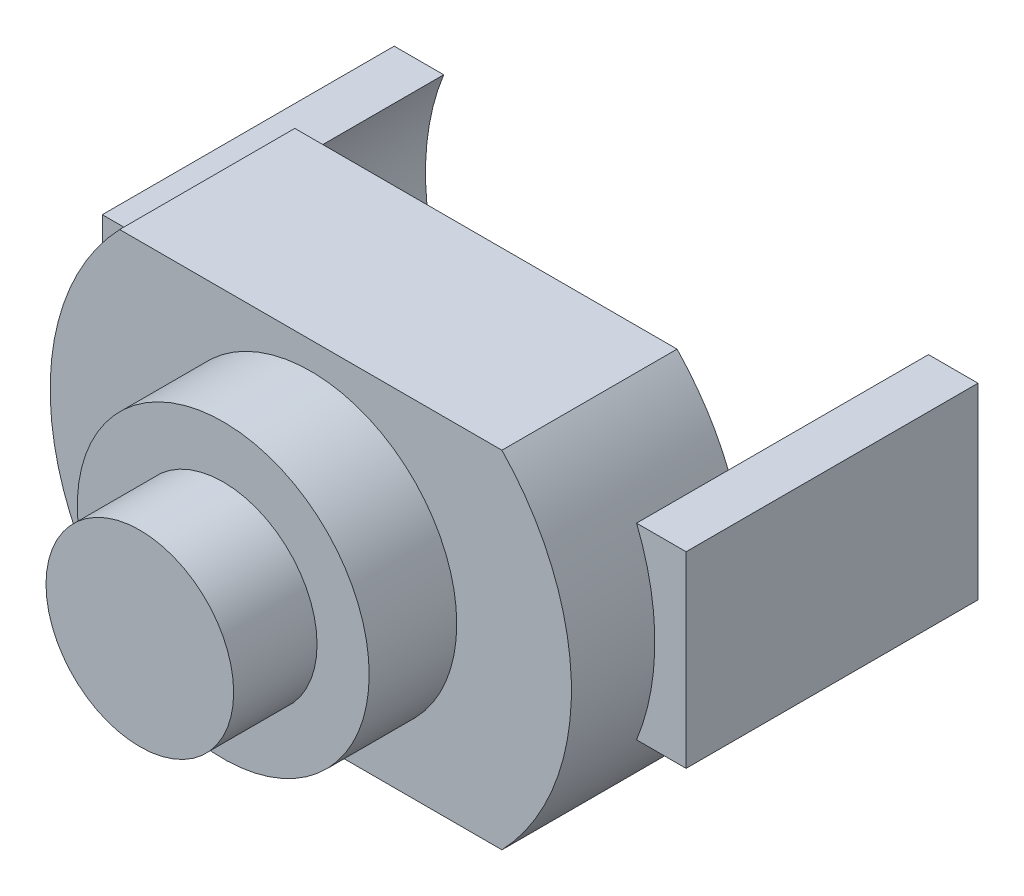
ISO-10303-21;
HEADER;
FILE_DESCRIPTION(('STEP AP214'),'2;1');
FILE_NAME('part.step','',(''),(''),'','','');
FILE_SCHEMA(('AUTOMOTIVE_DESIGN { 1 0 10303 214 1 1 1 1 }'));
ENDSEC;
DATA;
#1=APPLICATION_CONTEXT('core data for automotive mechanical design processes');
#2=APPLICATION_PROTOCOL_DEFINITION('international standard','automotive_design',2000,#1);
#3=PRODUCT_CONTEXT('',#1,'mechanical');
#4=PRODUCT('Part','Part','',(#3));
#5=PRODUCT_RELATED_PRODUCT_CATEGORY('part','',(#4));
#6=PRODUCT_DEFINITION_FORMATION('','',#4);
#7=PRODUCT_DEFINITION_CONTEXT('part definition',#1,'design');
#8=PRODUCT_DEFINITION('design','',#6,#7);
#9=PRODUCT_DEFINITION_SHAPE('','',#8);
#10=(LENGTH_UNIT() NAMED_UNIT(*) SI_UNIT(.MILLI.,.METRE.));
#11=(NAMED_UNIT(*) PLANE_ANGLE_UNIT() SI_UNIT($,.RADIAN.));
#12=(NAMED_UNIT(*) SI_UNIT($,.STERADIAN.) SOLID_ANGLE_UNIT());
#13=UNCERTAINTY_MEASURE_WITH_UNIT(LENGTH_MEASURE(1.E-05),#10,'distance_accuracy_value','');
#14=(GEOMETRIC_REPRESENTATION_CONTEXT(3) GLOBAL_UNCERTAINTY_ASSIGNED_CONTEXT((#13)) GLOBAL_UNIT_ASSIGNED_CONTEXT((#10,
#11,#12)) REPRESENTATION_CONTEXT('',''));
#15=CARTESIAN_POINT('',(0.,0.,0.));
#16=DIRECTION('',(0.,0.,1.));
#17=DIRECTION('',(1.,0.,0.));
#18=AXIS2_PLACEMENT_3D('',#15,#16,#17);
#19=CARTESIAN_POINT('',(0.249999999999997,0.,4.2));
#20=DIRECTION('',(0.,0.,-1.));
#21=DIRECTION('',(-1.,0.,0.));
#22=AXIS2_PLACEMENT_3D('',#19,#20,#21);
#23=CYLINDRICAL_SURFACE('',#22,6.);
#24=CARTESIAN_POINT('',(0.249999999999997,0.,2.2));
#25=DIRECTION('',(0.,0.,1.));
#26=DIRECTION('',(1.,0.,0.));
#27=AXIS2_PLACEMENT_3D('',#24,#25,#26);
#28=CIRCLE('',#27,6.);
#29=CARTESIAN_POINT('',(5.81214886532174,-2.25,2.2));
#30=VERTEX_POINT('',#29);
#31=CARTESIAN_POINT('',(5.81214886532174,2.25,2.2));
#32=VERTEX_POINT('',#31);
#33=EDGE_CURVE('E163',#30,#32,#28,.T.);
#34=ORIENTED_EDGE('',*,*,#33,.T.);
#35=DIRECTION('',(0.,0.,1.));
#36=VECTOR('',#35,1.);
#37=CARTESIAN_POINT('',(5.81214886532174,2.25,-4.8));
#38=LINE('',#37,#36);
#39=CARTESIAN_POINT('',(5.81214886532174,2.25,0.));
#40=VERTEX_POINT('',#39);
#41=EDGE_CURVE('E175',#40,#32,#38,.T.);
#42=ORIENTED_EDGE('',*,*,#41,.F.);
#43=CARTESIAN_POINT('',(0.249999999999997,0.,0.));
#44=DIRECTION('',(0.,0.,1.));
#45=DIRECTION('',(1.,0.,0.));
#46=AXIS2_PLACEMENT_3D('',#43,#44,#45);
#47=CIRCLE('',#46,6.);
#48=CARTESIAN_POINT('',(4.58330128193274,4.15,0.));
#49=VERTEX_POINT('',#48);
#50=EDGE_CURVE('E236',#49,#40,#47,.F.);
#51=ORIENTED_EDGE('',*,*,#50,.F.);
#52=DIRECTION('',(0.,0.,-1.));
#53=VECTOR('',#52,1.);
#54=CARTESIAN_POINT('',(4.58330128193274,4.15,4.2));
#55=LINE('',#54,#53);
#56=CARTESIAN_POINT('',(4.58330128193274,4.15,4.2));
#57=VERTEX_POINT('',#56);
#58=EDGE_CURVE('E11',#57,#49,#55,.T.);
#59=ORIENTED_EDGE('',*,*,#58,.F.);
#60=CARTESIAN_POINT('',(0.249999999999997,0.,4.2));
#61=DIRECTION('',(0.,0.,1.));
#62=DIRECTION('',(1.,0.,0.));
#63=AXIS2_PLACEMENT_3D('',#60,#61,#62);
#64=CIRCLE('',#63,6.);
#65=CARTESIAN_POINT('',(4.58330128193274,-4.15,4.2));
#66=VERTEX_POINT('',#65);
#67=EDGE_CURVE('E224',#57,#66,#64,.F.);
#68=ORIENTED_EDGE('',*,*,#67,.T.);
#69=DIRECTION('',(0.,0.,-1.));
#70=VECTOR('',#69,1.);
#71=CARTESIAN_POINT('',(4.58330128193274,-4.15,4.2));
#72=LINE('',#71,#70);
#73=CARTESIAN_POINT('',(4.58330128193274,-4.15,0.));
#74=VERTEX_POINT('',#73);
#75=EDGE_CURVE('E235',#66,#74,#72,.T.);
#76=ORIENTED_EDGE('',*,*,#75,.T.);
#77=CARTESIAN_POINT('',(5.81214886532174,-2.25,0.));
#78=VERTEX_POINT('',#77);
#79=EDGE_CURVE('E221',#78,#74,#47,.F.);
#80=ORIENTED_EDGE('',*,*,#79,.F.);
#81=DIRECTION('',(0.,0.,1.));
#82=VECTOR('',#81,1.);
#83=CARTESIAN_POINT('',(5.81214886532174,-2.25,-4.8));
#84=LINE('',#83,#82);
#85=EDGE_CURVE('E141',#78,#30,#84,.T.);
#86=ORIENTED_EDGE('',*,*,#85,.T.);
#87=EDGE_LOOP('',(#34,#42,#51,#59,#68,#76,#80,#86));
#88=FACE_BOUND('',#87,.T.);
#89=ADVANCED_FACE('F37',(#88),#23,.T.);
#90=CARTESIAN_POINT('',(-0.250000000000002,0.,4.2));
#91=DIRECTION('',(0.,0.,-1.));
#92=DIRECTION('',(-1.,0.,0.));
#93=AXIS2_PLACEMENT_3D('',#90,#91,#92);
#94=CYLINDRICAL_SURFACE('',#93,6.);
#95=DIRECTION('',(0.,0.,1.));
#96=VECTOR('',#95,1.);
#97=CARTESIAN_POINT('',(-5.81214886532175,2.25,-4.8));
#98=LINE('',#97,#96);
#99=CARTESIAN_POINT('',(-5.81214886532175,2.25,0.));
#100=VERTEX_POINT('',#99);
#101=CARTESIAN_POINT('',(-5.81214886532175,2.25,2.2));
#102=VERTEX_POINT('',#101);
#103=EDGE_CURVE('E206',#100,#102,#98,.T.);
#104=ORIENTED_EDGE('',*,*,#103,.T.);
#105=CARTESIAN_POINT('',(-0.250000000000002,0.,2.2));
#106=DIRECTION('',(0.,0.,1.));
#107=DIRECTION('',(1.,0.,0.));
#108=AXIS2_PLACEMENT_3D('',#105,#106,#107);
#109=CIRCLE('',#108,6.);
#110=CARTESIAN_POINT('',(-5.81214886532175,-2.25,2.2));
#111=VERTEX_POINT('',#110);
#112=EDGE_CURVE('E59',#102,#111,#109,.T.);
#113=ORIENTED_EDGE('',*,*,#112,.T.);
#114=DIRECTION('',(0.,0.,1.));
#115=VECTOR('',#114,1.);
#116=CARTESIAN_POINT('',(-5.81214886532175,-2.25,-4.8));
#117=LINE('',#116,#115);
#118=CARTESIAN_POINT('',(-5.81214886532175,-2.25,0.));
#119=VERTEX_POINT('',#118);
#120=EDGE_CURVE('E210',#119,#111,#117,.T.);
#121=ORIENTED_EDGE('',*,*,#120,.F.);
#122=CARTESIAN_POINT('',(-0.250000000000002,0.,0.));
#123=DIRECTION('',(0.,0.,1.));
#124=DIRECTION('',(1.,0.,0.));
#125=AXIS2_PLACEMENT_3D('',#122,#123,#124);
#126=CIRCLE('',#125,6.);
#127=CARTESIAN_POINT('',(-4.58330128193276,-4.15,0.));
#128=VERTEX_POINT('',#127);
#129=EDGE_CURVE('E243',#119,#128,#126,.T.);
#130=ORIENTED_EDGE('',*,*,#129,.T.);
#131=DIRECTION('',(0.,0.,-1.));
#132=VECTOR('',#131,1.);
#133=CARTESIAN_POINT('',(-4.58330128193276,-4.15,4.2));
#134=LINE('',#133,#132);
#135=CARTESIAN_POINT('',(-4.58330128193276,-4.15,4.2));
#136=VERTEX_POINT('',#135);
#137=EDGE_CURVE('E252',#136,#128,#134,.T.);
#138=ORIENTED_EDGE('',*,*,#137,.F.);
#139=CARTESIAN_POINT('',(-0.250000000000002,0.,4.2));
#140=DIRECTION('',(0.,0.,1.));
#141=DIRECTION('',(1.,0.,0.));
#142=AXIS2_PLACEMENT_3D('',#139,#140,#141);
#143=CIRCLE('',#142,6.);
#144=CARTESIAN_POINT('',(-4.58330128193276,4.15,4.2));
#145=VERTEX_POINT('',#144);
#146=EDGE_CURVE('E231',#145,#136,#143,.T.);
#147=ORIENTED_EDGE('',*,*,#146,.F.);
#148=DIRECTION('',(0.,0.,-1.));
#149=VECTOR('',#148,1.);
#150=CARTESIAN_POINT('',(-4.58330128193276,4.15,4.2));
#151=LINE('',#150,#149);
#152=CARTESIAN_POINT('',(-4.58330128193276,4.15,0.));
#153=VERTEX_POINT('',#152);
#154=EDGE_CURVE('E44',#145,#153,#151,.T.);
#155=ORIENTED_EDGE('',*,*,#154,.T.);
#156=EDGE_CURVE('E244',#153,#100,#126,.T.);
#157=ORIENTED_EDGE('',*,*,#156,.T.);
#158=EDGE_LOOP('',(#104,#113,#121,#130,#138,#147,#155,#157));
#159=FACE_BOUND('',#158,.T.);
#160=ADVANCED_FACE('F256',(#159),#94,.T.);
#161=CARTESIAN_POINT('',(0.,4.15,4.2));
#162=DIRECTION('',(0.,1.,0.));
#163=DIRECTION('',(0.,0.,1.));
#164=AXIS2_PLACEMENT_3D('',#161,#162,#163);
#165=PLANE('',#164);
#166=DIRECTION('',(1.,0.,0.));
#167=VECTOR('',#166,1.);
#168=CARTESIAN_POINT('',(0.,4.15,0.));
#169=LINE('',#168,#167);
#170=EDGE_CURVE('E239',#153,#49,#169,.T.);
#171=ORIENTED_EDGE('',*,*,#170,.F.);
#172=ORIENTED_EDGE('',*,*,#154,.F.);
#173=DIRECTION('',(1.,0.,0.));
#174=VECTOR('',#173,1.);
#175=CARTESIAN_POINT('',(0.,4.15,4.2));
#176=LINE('',#175,#174);
#177=EDGE_CURVE('E227',#145,#57,#176,.T.);
#178=ORIENTED_EDGE('',*,*,#177,.T.);
#179=ORIENTED_EDGE('',*,*,#58,.T.);
#180=EDGE_LOOP('',(#171,#172,#178,#179));
#181=FACE_BOUND('',#180,.T.);
#182=ADVANCED_FACE('F265',(#181),#165,.T.);
#183=CARTESIAN_POINT('',(0.,-4.15,4.2));
#184=DIRECTION('',(0.,1.,0.));
#185=DIRECTION('',(0.,0.,1.));
#186=AXIS2_PLACEMENT_3D('',#183,#184,#185);
#187=PLANE('',#186);
#188=DIRECTION('',(1.,0.,0.));
#189=VECTOR('',#188,1.);
#190=CARTESIAN_POINT('',(0.,-4.15,0.));
#191=LINE('',#190,#189);
#192=EDGE_CURVE('E228',#128,#74,#191,.T.);
#193=ORIENTED_EDGE('',*,*,#192,.T.);
#194=ORIENTED_EDGE('',*,*,#75,.F.);
#195=DIRECTION('',(1.,0.,0.));
#196=VECTOR('',#195,1.);
#197=CARTESIAN_POINT('',(0.,-4.15,4.2));
#198=LINE('',#197,#196);
#199=EDGE_CURVE('E233',#136,#66,#198,.T.);
#200=ORIENTED_EDGE('',*,*,#199,.F.);
#201=ORIENTED_EDGE('',*,*,#137,.T.);
#202=EDGE_LOOP('',(#193,#194,#200,#201));
#203=FACE_BOUND('',#202,.T.);
#204=ADVANCED_FACE('F283',(#203),#187,.F.);
#205=CARTESIAN_POINT('',(0.,0.,4.2));
#206=DIRECTION('',(0.,0.,1.));
#207=DIRECTION('',(1.,0.,0.));
#208=AXIS2_PLACEMENT_3D('',#205,#206,#207);
#209=PLANE('',#208);
#210=CARTESIAN_POINT('',(0.,0.,4.2));
#211=DIRECTION('',(0.,0.,1.));
#212=DIRECTION('',(1.,0.,0.));
#213=AXIS2_PLACEMENT_3D('',#210,#211,#212);
#214=CIRCLE('',#213,3.5);
#215=CARTESIAN_POINT('',(3.5,0.,4.2));
#216=VERTEX_POINT('',#215);
#217=EDGE_CURVE('E215',#216,#216,#214,.T.);
#218=ORIENTED_EDGE('',*,*,#217,.F.);
#219=EDGE_LOOP('',(#218));
#220=FACE_BOUND('',#219,.T.);
#221=ORIENTED_EDGE('',*,*,#67,.F.);
#222=ORIENTED_EDGE('',*,*,#177,.F.);
#223=ORIENTED_EDGE('',*,*,#146,.T.);
#224=ORIENTED_EDGE('',*,*,#199,.T.);
#225=EDGE_LOOP('',(#221,#222,#223,#224));
#226=FACE_BOUND('',#225,.T.);
#227=ADVANCED_FACE('F325',(#220,#226),#209,.T.);
#228=CARTESIAN_POINT('',(0.,0.,0.));
#229=DIRECTION('',(0.,0.,1.));
#230=DIRECTION('',(1.,0.,0.));
#231=AXIS2_PLACEMENT_3D('',#228,#229,#230);
#232=PLANE('',#231);
#233=ORIENTED_EDGE('',*,*,#50,.T.);
#234=EDGE_CURVE('E240',#40,#78,#47,.F.);
#235=ORIENTED_EDGE('',*,*,#234,.T.);
#236=ORIENTED_EDGE('',*,*,#79,.T.);
#237=ORIENTED_EDGE('',*,*,#192,.F.);
#238=ORIENTED_EDGE('',*,*,#129,.F.);
#239=EDGE_CURVE('E247',#100,#119,#126,.T.);
#240=ORIENTED_EDGE('',*,*,#239,.F.);
#241=ORIENTED_EDGE('',*,*,#156,.F.);
#242=ORIENTED_EDGE('',*,*,#170,.T.);
#243=EDGE_LOOP('',(#233,#235,#236,#237,#238,#240,#241,#242));
#244=FACE_BOUND('',#243,.T.);
#245=ADVANCED_FACE('F263',(#244),#232,.F.);
#246=CARTESIAN_POINT('',(0.,0.,6.3));
#247=DIRECTION('',(0.,0.,-1.));
#248=DIRECTION('',(-1.,0.,0.));
#249=AXIS2_PLACEMENT_3D('',#246,#247,#248);
#250=CYLINDRICAL_SURFACE('',#249,3.5);
#251=CARTESIAN_POINT('',(0.,0.,6.3));
#252=DIRECTION('',(0.,0.,1.));
#253=DIRECTION('',(1.,0.,0.));
#254=AXIS2_PLACEMENT_3D('',#251,#252,#253);
#255=CIRCLE('',#254,3.5);
#256=CARTESIAN_POINT('',(3.5,0.,6.3));
#257=VERTEX_POINT('',#256);
#258=EDGE_CURVE('E218',#257,#257,#255,.T.);
#259=ORIENTED_EDGE('',*,*,#258,.F.);
#260=EDGE_LOOP('',(#259));
#261=FACE_BOUND('',#260,.T.);
#262=ORIENTED_EDGE('',*,*,#217,.T.);
#263=EDGE_LOOP('',(#262));
#264=FACE_BOUND('',#263,.T.);
#265=ADVANCED_FACE('F328',(#261,#264),#250,.T.);
#266=CARTESIAN_POINT('',(0.,0.,6.3));
#267=DIRECTION('',(0.,0.,1.));
#268=DIRECTION('',(1.,0.,0.));
#269=AXIS2_PLACEMENT_3D('',#266,#267,#268);
#270=PLANE('',#269);
#271=CARTESIAN_POINT('',(0.,0.,6.3));
#272=DIRECTION('',(0.,0.,1.));
#273=DIRECTION('',(1.,0.,0.));
#274=AXIS2_PLACEMENT_3D('',#271,#272,#273);
#275=CIRCLE('',#274,2.25);
#276=CARTESIAN_POINT('',(2.25,0.,6.3));
#277=VERTEX_POINT('',#276);
#278=EDGE_CURVE('E202',#277,#277,#275,.T.);
#279=ORIENTED_EDGE('',*,*,#278,.F.);
#280=EDGE_LOOP('',(#279));
#281=FACE_BOUND('',#280,.T.);
#282=ORIENTED_EDGE('',*,*,#258,.T.);
#283=EDGE_LOOP('',(#282));
#284=FACE_BOUND('',#283,.T.);
#285=ADVANCED_FACE('F334',(#281,#284),#270,.T.);
#286=CARTESIAN_POINT('',(0.,0.,8.3));
#287=DIRECTION('',(0.,0.,-1.));
#288=DIRECTION('',(-1.,0.,0.));
#289=AXIS2_PLACEMENT_3D('',#286,#287,#288);
#290=CYLINDRICAL_SURFACE('',#289,2.25);
#291=CARTESIAN_POINT('',(0.,0.,8.3));
#292=DIRECTION('',(0.,0.,1.));
#293=DIRECTION('',(1.,0.,0.));
#294=AXIS2_PLACEMENT_3D('',#291,#292,#293);
#295=CIRCLE('',#294,2.25);
#296=CARTESIAN_POINT('',(2.25,0.,8.3));
#297=VERTEX_POINT('',#296);
#298=EDGE_CURVE('E212',#297,#297,#295,.T.);
#299=ORIENTED_EDGE('',*,*,#298,.F.);
#300=EDGE_LOOP('',(#299));
#301=FACE_BOUND('',#300,.T.);
#302=ORIENTED_EDGE('',*,*,#278,.T.);
#303=EDGE_LOOP('',(#302));
#304=FACE_BOUND('',#303,.T.);
#305=ADVANCED_FACE('F338',(#301,#304),#290,.T.);
#306=CARTESIAN_POINT('',(0.,0.,8.3));
#307=DIRECTION('',(0.,0.,1.));
#308=DIRECTION('',(1.,0.,0.));
#309=AXIS2_PLACEMENT_3D('',#306,#307,#308);
#310=PLANE('',#309);
#311=ORIENTED_EDGE('',*,*,#298,.T.);
#312=EDGE_LOOP('',(#311));
#313=FACE_BOUND('',#312,.T.);
#314=ADVANCED_FACE('F342',(#313),#310,.T.);
#315=CARTESIAN_POINT('',(-0.250000000000002,0.,-4.8));
#316=DIRECTION('',(0.,0.,1.));
#317=DIRECTION('',(1.,0.,0.));
#318=AXIS2_PLACEMENT_3D('',#315,#316,#317);
#319=CYLINDRICAL_SURFACE('',#318,6.);
#320=CARTESIAN_POINT('',(-5.81214886532175,2.25,-4.8));
#321=VERTEX_POINT('',#320);
#322=EDGE_CURVE('E203',#321,#100,#98,.T.);
#323=ORIENTED_EDGE('',*,*,#322,.T.);
#324=ORIENTED_EDGE('',*,*,#239,.T.);
#325=CARTESIAN_POINT('',(-5.81214886532175,-2.25,-4.8));
#326=VERTEX_POINT('',#325);
#327=EDGE_CURVE('E207',#326,#119,#117,.T.);
#328=ORIENTED_EDGE('',*,*,#327,.F.);
#329=CARTESIAN_POINT('',(-0.250000000000002,0.,-4.8));
#330=DIRECTION('',(0.,0.,1.));
#331=DIRECTION('',(1.,0.,0.));
#332=AXIS2_PLACEMENT_3D('',#329,#330,#331);
#333=CIRCLE('',#332,6.);
#334=EDGE_CURVE('E187',#321,#326,#333,.T.);
#335=ORIENTED_EDGE('',*,*,#334,.F.);
#336=EDGE_LOOP('',(#323,#324,#328,#335));
#337=FACE_BOUND('',#336,.T.);
#338=ADVANCED_FACE('F288',(#337),#319,.F.);
#339=CARTESIAN_POINT('',(-7.,0.,-4.8));
#340=DIRECTION('',(-1.,0.,0.));
#341=DIRECTION('',(0.,-1.,0.));
#342=AXIS2_PLACEMENT_3D('',#339,#340,#341);
#343=PLANE('',#342);
#344=DIRECTION('',(0.,-1.,0.));
#345=VECTOR('',#344,1.);
#346=CARTESIAN_POINT('',(-7.,0.,2.2));
#347=LINE('',#346,#345);
#348=CARTESIAN_POINT('',(-7.,2.25,2.2));
#349=VERTEX_POINT('',#348);
#350=CARTESIAN_POINT('',(-7.,-2.25,2.2));
#351=VERTEX_POINT('',#350);
#352=EDGE_CURVE('E174',#349,#351,#347,.T.);
#353=ORIENTED_EDGE('',*,*,#352,.F.);
#354=DIRECTION('',(0.,0.,1.));
#355=VECTOR('',#354,1.);
#356=CARTESIAN_POINT('',(-7.,2.25,-4.8));
#357=LINE('',#356,#355);
#358=CARTESIAN_POINT('',(-7.,2.25,-4.8));
#359=VERTEX_POINT('',#358);
#360=EDGE_CURVE('E200',#359,#349,#357,.T.);
#361=ORIENTED_EDGE('',*,*,#360,.F.);
#362=DIRECTION('',(0.,-1.,0.));
#363=VECTOR('',#362,1.);
#364=CARTESIAN_POINT('',(-7.,0.,-4.8));
#365=LINE('',#364,#363);
#366=CARTESIAN_POINT('',(-7.,-2.25,-4.8));
#367=VERTEX_POINT('',#366);
#368=EDGE_CURVE('E180',#359,#367,#365,.T.);
#369=ORIENTED_EDGE('',*,*,#368,.T.);
#370=DIRECTION('',(0.,0.,1.));
#371=VECTOR('',#370,1.);
#372=CARTESIAN_POINT('',(-7.,-2.25,-4.8));
#373=LINE('',#372,#371);
#374=EDGE_CURVE('E191',#367,#351,#373,.T.);
#375=ORIENTED_EDGE('',*,*,#374,.T.);
#376=EDGE_LOOP('',(#353,#361,#369,#375));
#377=FACE_BOUND('',#376,.T.);
#378=ADVANCED_FACE('F298',(#377),#343,.T.);
#379=CARTESIAN_POINT('',(0.,2.25,-4.8));
#380=DIRECTION('',(0.,-1.,0.));
#381=DIRECTION('',(0.,0.,-1.));
#382=AXIS2_PLACEMENT_3D('',#379,#380,#381);
#383=PLANE('',#382);
#384=DIRECTION('',(1.,0.,0.));
#385=VECTOR('',#384,1.);
#386=CARTESIAN_POINT('',(0.,2.25,2.2));
#387=LINE('',#386,#385);
#388=EDGE_CURVE('E184',#349,#102,#387,.T.);
#389=ORIENTED_EDGE('',*,*,#388,.T.);
#390=ORIENTED_EDGE('',*,*,#103,.F.);
#391=ORIENTED_EDGE('',*,*,#322,.F.);
#392=DIRECTION('',(1.,0.,0.));
#393=VECTOR('',#392,1.);
#394=CARTESIAN_POINT('',(0.,2.25,-4.8));
#395=LINE('',#394,#393);
#396=EDGE_CURVE('E189',#359,#321,#395,.T.);
#397=ORIENTED_EDGE('',*,*,#396,.F.);
#398=ORIENTED_EDGE('',*,*,#360,.T.);
#399=EDGE_LOOP('',(#389,#390,#391,#397,#398));
#400=FACE_BOUND('',#399,.T.);
#401=ADVANCED_FACE('F302',(#400),#383,.F.);
#402=CARTESIAN_POINT('',(0.,-2.25,-4.8));
#403=DIRECTION('',(0.,-1.,0.));
#404=DIRECTION('',(0.,0.,-1.));
#405=AXIS2_PLACEMENT_3D('',#402,#403,#404);
#406=PLANE('',#405);
#407=DIRECTION('',(1.,0.,0.));
#408=VECTOR('',#407,1.);
#409=CARTESIAN_POINT('',(0.,-2.25,2.2));
#410=LINE('',#409,#408);
#411=EDGE_CURVE('E194',#351,#111,#410,.T.);
#412=ORIENTED_EDGE('',*,*,#411,.F.);
#413=ORIENTED_EDGE('',*,*,#374,.F.);
#414=DIRECTION('',(1.,0.,0.));
#415=VECTOR('',#414,1.);
#416=CARTESIAN_POINT('',(0.,-2.25,-4.8));
#417=LINE('',#416,#415);
#418=EDGE_CURVE('E183',#367,#326,#417,.T.);
#419=ORIENTED_EDGE('',*,*,#418,.T.);
#420=ORIENTED_EDGE('',*,*,#327,.T.);
#421=ORIENTED_EDGE('',*,*,#120,.T.);
#422=EDGE_LOOP('',(#412,#413,#419,#420,#421));
#423=FACE_BOUND('',#422,.T.);
#424=ADVANCED_FACE('F291',(#423),#406,.T.);
#425=CARTESIAN_POINT('',(0.,0.,-4.8));
#426=DIRECTION('',(0.,0.,1.));
#427=DIRECTION('',(1.,0.,0.));
#428=AXIS2_PLACEMENT_3D('',#425,#426,#427);
#429=PLANE('',#428);
#430=ORIENTED_EDGE('',*,*,#368,.F.);
#431=ORIENTED_EDGE('',*,*,#396,.T.);
#432=ORIENTED_EDGE('',*,*,#334,.T.);
#433=ORIENTED_EDGE('',*,*,#418,.F.);
#434=EDGE_LOOP('',(#430,#431,#432,#433));
#435=FACE_BOUND('',#434,.T.);
#436=ADVANCED_FACE('F295',(#435),#429,.F.);
#437=CARTESIAN_POINT('',(0.,0.,2.2));
#438=DIRECTION('',(0.,0.,1.));
#439=DIRECTION('',(1.,0.,0.));
#440=AXIS2_PLACEMENT_3D('',#437,#438,#439);
#441=PLANE('',#440);
#442=ORIENTED_EDGE('',*,*,#352,.T.);
#443=ORIENTED_EDGE('',*,*,#411,.T.);
#444=ORIENTED_EDGE('',*,*,#112,.F.);
#445=ORIENTED_EDGE('',*,*,#388,.F.);
#446=EDGE_LOOP('',(#442,#443,#444,#445));
#447=FACE_BOUND('',#446,.T.);
#448=ADVANCED_FACE('F304',(#447),#441,.T.);
#449=CARTESIAN_POINT('',(0.249999999999997,0.,-4.8));
#450=DIRECTION('',(0.,0.,1.));
#451=DIRECTION('',(1.,0.,0.));
#452=AXIS2_PLACEMENT_3D('',#449,#450,#451);
#453=CYLINDRICAL_SURFACE('',#452,6.);
#454=CARTESIAN_POINT('',(5.81214886532174,-2.25,-4.8));
#455=VERTEX_POINT('',#454);
#456=EDGE_CURVE('E51',#455,#78,#84,.T.);
#457=ORIENTED_EDGE('',*,*,#456,.T.);
#458=ORIENTED_EDGE('',*,*,#234,.F.);
#459=CARTESIAN_POINT('',(5.81214886532174,2.25,-4.8));
#460=VERTEX_POINT('',#459);
#461=EDGE_CURVE('E150',#460,#40,#38,.T.);
#462=ORIENTED_EDGE('',*,*,#461,.F.);
#463=CARTESIAN_POINT('',(0.249999999999997,0.,-4.8));
#464=DIRECTION('',(0.,0.,1.));
#465=DIRECTION('',(1.,0.,0.));
#466=AXIS2_PLACEMENT_3D('',#463,#464,#465);
#467=CIRCLE('',#466,6.);
#468=EDGE_CURVE('E147',#455,#460,#467,.T.);
#469=ORIENTED_EDGE('',*,*,#468,.F.);
#470=EDGE_LOOP('',(#457,#458,#462,#469));
#471=FACE_BOUND('',#470,.T.);
#472=ADVANCED_FACE('F148',(#471),#453,.F.);
#473=CARTESIAN_POINT('',(0.,2.25,-4.8));
#474=DIRECTION('',(0.,-1.,0.));
#475=DIRECTION('',(0.,0.,-1.));
#476=AXIS2_PLACEMENT_3D('',#473,#474,#475);
#477=PLANE('',#476);
#478=DIRECTION('',(1.,0.,0.));
#479=VECTOR('',#478,1.);
#480=CARTESIAN_POINT('',(0.,2.25,2.2));
#481=LINE('',#480,#479);
#482=CARTESIAN_POINT('',(7.,2.25,2.2));
#483=VERTEX_POINT('',#482);
#484=EDGE_CURVE('E152',#32,#483,#481,.T.);
#485=ORIENTED_EDGE('',*,*,#484,.T.);
#486=DIRECTION('',(0.,0.,1.));
#487=VECTOR('',#486,1.);
#488=CARTESIAN_POINT('',(7.,2.25,-4.8));
#489=LINE('',#488,#487);
#490=CARTESIAN_POINT('',(7.,2.25,-4.8));
#491=VERTEX_POINT('',#490);
#492=EDGE_CURVE('E176',#491,#483,#489,.T.);
#493=ORIENTED_EDGE('',*,*,#492,.F.);
#494=DIRECTION('',(1.,0.,0.));
#495=VECTOR('',#494,1.);
#496=CARTESIAN_POINT('',(0.,2.25,-4.8));
#497=LINE('',#496,#495);
#498=EDGE_CURVE('E159',#460,#491,#497,.T.);
#499=ORIENTED_EDGE('',*,*,#498,.F.);
#500=ORIENTED_EDGE('',*,*,#461,.T.);
#501=ORIENTED_EDGE('',*,*,#41,.T.);
#502=EDGE_LOOP('',(#485,#493,#499,#500,#501));
#503=FACE_BOUND('',#502,.T.);
#504=ADVANCED_FACE('F273',(#503),#477,.F.);
#505=CARTESIAN_POINT('',(7.,0.,-4.8));
#506=DIRECTION('',(-1.,0.,0.));
#507=DIRECTION('',(0.,-1.,0.));
#508=AXIS2_PLACEMENT_3D('',#505,#506,#507);
#509=PLANE('',#508);
#510=DIRECTION('',(0.,-1.,0.));
#511=VECTOR('',#510,1.);
#512=CARTESIAN_POINT('',(7.,0.,2.2));
#513=LINE('',#512,#511);
#514=CARTESIAN_POINT('',(7.,-2.25,2.2));
#515=VERTEX_POINT('',#514);
#516=EDGE_CURVE('E169',#483,#515,#513,.T.);
#517=ORIENTED_EDGE('',*,*,#516,.T.);
#518=DIRECTION('',(0.,0.,1.));
#519=VECTOR('',#518,1.);
#520=CARTESIAN_POINT('',(7.,-2.25,-4.8));
#521=LINE('',#520,#519);
#522=CARTESIAN_POINT('',(7.,-2.25,-4.8));
#523=VERTEX_POINT('',#522);
#524=EDGE_CURVE('E143',#523,#515,#521,.T.);
#525=ORIENTED_EDGE('',*,*,#524,.F.);
#526=DIRECTION('',(0.,-1.,0.));
#527=VECTOR('',#526,1.);
#528=CARTESIAN_POINT('',(7.,0.,-4.8));
#529=LINE('',#528,#527);
#530=EDGE_CURVE('E156',#491,#523,#529,.T.);
#531=ORIENTED_EDGE('',*,*,#530,.F.);
#532=ORIENTED_EDGE('',*,*,#492,.T.);
#533=EDGE_LOOP('',(#517,#525,#531,#532));
#534=FACE_BOUND('',#533,.T.);
#535=ADVANCED_FACE('F278',(#534),#509,.F.);
#536=CARTESIAN_POINT('',(0.,-2.25,-4.8));
#537=DIRECTION('',(0.,-1.,0.));
#538=DIRECTION('',(0.,0.,-1.));
#539=AXIS2_PLACEMENT_3D('',#536,#537,#538);
#540=PLANE('',#539);
#541=DIRECTION('',(1.,0.,0.));
#542=VECTOR('',#541,1.);
#543=CARTESIAN_POINT('',(0.,-2.25,2.2));
#544=LINE('',#543,#542);
#545=EDGE_CURVE('E166',#30,#515,#544,.T.);
#546=ORIENTED_EDGE('',*,*,#545,.F.);
#547=ORIENTED_EDGE('',*,*,#85,.F.);
#548=ORIENTED_EDGE('',*,*,#456,.F.);
#549=DIRECTION('',(1.,0.,0.));
#550=VECTOR('',#549,1.);
#551=CARTESIAN_POINT('',(0.,-2.25,-4.8));
#552=LINE('',#551,#550);
#553=EDGE_CURVE('E139',#455,#523,#552,.T.);
#554=ORIENTED_EDGE('',*,*,#553,.T.);
#555=ORIENTED_EDGE('',*,*,#524,.T.);
#556=EDGE_LOOP('',(#546,#547,#548,#554,#555));
#557=FACE_BOUND('',#556,.T.);
#558=ADVANCED_FACE('F137',(#557),#540,.T.);
#559=CARTESIAN_POINT('',(0.,0.,-4.8));
#560=DIRECTION('',(0.,0.,1.));
#561=DIRECTION('',(1.,0.,0.));
#562=AXIS2_PLACEMENT_3D('',#559,#560,#561);
#563=PLANE('',#562);
#564=ORIENTED_EDGE('',*,*,#468,.T.);
#565=ORIENTED_EDGE('',*,*,#498,.T.);
#566=ORIENTED_EDGE('',*,*,#530,.T.);
#567=ORIENTED_EDGE('',*,*,#553,.F.);
#568=EDGE_LOOP('',(#564,#565,#566,#567));
#569=FACE_BOUND('',#568,.T.);
#570=ADVANCED_FACE('F154',(#569),#563,.F.);
#571=CARTESIAN_POINT('',(0.,0.,2.2));
#572=DIRECTION('',(0.,0.,1.));
#573=DIRECTION('',(1.,0.,0.));
#574=AXIS2_PLACEMENT_3D('',#571,#572,#573);
#575=PLANE('',#574);
#576=ORIENTED_EDGE('',*,*,#33,.F.);
#577=ORIENTED_EDGE('',*,*,#545,.T.);
#578=ORIENTED_EDGE('',*,*,#516,.F.);
#579=ORIENTED_EDGE('',*,*,#484,.F.);
#580=EDGE_LOOP('',(#576,#577,#578,#579));
#581=FACE_BOUND('',#580,.T.);
#582=ADVANCED_FACE('F409',(#581),#575,.T.);
#583=CLOSED_SHELL('',(#89,#160,#182,#204,#227,#245,#265,#285,#305,#314,#338,#378,#401,#424,#436,
#448,#472,#504,#535,#558,#570,#582));
#584=MANIFOLD_SOLID_BREP('B2',#583);
#585=ADVANCED_BREP_SHAPE_REPRESENTATION('',(#18,#584),#14);
#586=SHAPE_DEFINITION_REPRESENTATION(#9,#585);
ENDSEC;
END-ISO-10303-21;
